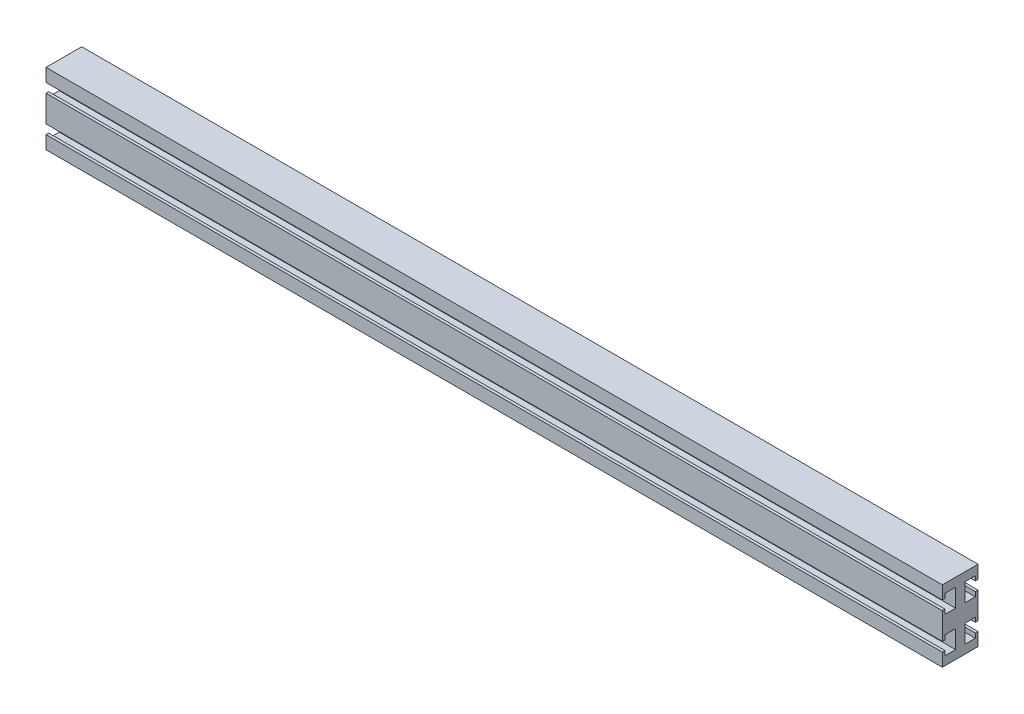
ISO-10303-21;
HEADER;
FILE_DESCRIPTION(('STEP AP214'),'2;1');
FILE_NAME('part.step','',(''),(''),'','','');
FILE_SCHEMA(('AUTOMOTIVE_DESIGN { 1 0 10303 214 1 1 1 1 }'));
ENDSEC;
DATA;
#1=APPLICATION_CONTEXT('core data for automotive mechanical design processes');
#2=APPLICATION_PROTOCOL_DEFINITION('international standard','automotive_design',2000,#1);
#3=PRODUCT_CONTEXT('',#1,'mechanical');
#4=PRODUCT('Part','Part','',(#3));
#5=PRODUCT_RELATED_PRODUCT_CATEGORY('part','',(#4));
#6=PRODUCT_DEFINITION_FORMATION('','',#4);
#7=PRODUCT_DEFINITION_CONTEXT('part definition',#1,'design');
#8=PRODUCT_DEFINITION('design','',#6,#7);
#9=PRODUCT_DEFINITION_SHAPE('','',#8);
#10=(LENGTH_UNIT() NAMED_UNIT(*) SI_UNIT(.MILLI.,.METRE.));
#11=(NAMED_UNIT(*) PLANE_ANGLE_UNIT() SI_UNIT($,.RADIAN.));
#12=(NAMED_UNIT(*) SI_UNIT($,.STERADIAN.) SOLID_ANGLE_UNIT());
#13=UNCERTAINTY_MEASURE_WITH_UNIT(LENGTH_MEASURE(1.E-05),#10,'distance_accuracy_value','');
#14=(GEOMETRIC_REPRESENTATION_CONTEXT(3) GLOBAL_UNCERTAINTY_ASSIGNED_CONTEXT((#13)) GLOBAL_UNIT_ASSIGNED_CONTEXT((#10,
#11,#12)) REPRESENTATION_CONTEXT('',''));
#15=CARTESIAN_POINT('',(0.,0.,0.));
#16=DIRECTION('',(0.,0.,1.));
#17=DIRECTION('',(1.,0.,0.));
#18=AXIS2_PLACEMENT_3D('',#15,#16,#17);
#19=CARTESIAN_POINT('',(250.,19.91,9.95));
#20=DIRECTION('',(-1.,0.,0.));
#21=DIRECTION('',(0.,0.,1.));
#22=AXIS2_PLACEMENT_3D('',#19,#20,#21);
#23=PLANE('',#22);
#24=DIRECTION('',(0.,0.,-1.));
#25=VECTOR('',#24,1.);
#26=CARTESIAN_POINT('',(250.,-7.42,9.95));
#27=LINE('',#26,#25);
#28=CARTESIAN_POINT('',(250.,-7.42,9.95));
#29=VERTEX_POINT('',#28);
#30=CARTESIAN_POINT('',(250.,-7.42,8.45));
#31=VERTEX_POINT('',#30);
#32=EDGE_CURVE('E289',#29,#31,#27,.T.);
#33=ORIENTED_EDGE('',*,*,#32,.T.);
#34=DIRECTION('',(0.,1.,0.));
#35=VECTOR('',#34,1.);
#36=CARTESIAN_POINT('',(250.,-7.42,8.45));
#37=LINE('',#36,#35);
#38=CARTESIAN_POINT('',(250.,-4.92,8.45));
#39=VERTEX_POINT('',#38);
#40=EDGE_CURVE('E292',#31,#39,#37,.T.);
#41=ORIENTED_EDGE('',*,*,#40,.T.);
#42=DIRECTION('',(0.,0.,-1.));
#43=VECTOR('',#42,1.);
#44=CARTESIAN_POINT('',(250.,-4.92,8.45));
#45=LINE('',#44,#43);
#46=CARTESIAN_POINT('',(250.,-4.92,2.56));
#47=VERTEX_POINT('',#46);
#48=EDGE_CURVE('E313',#39,#47,#45,.T.);
#49=ORIENTED_EDGE('',*,*,#48,.T.);
#50=DIRECTION('',(0.,-1.,0.));
#51=VECTOR('',#50,1.);
#52=CARTESIAN_POINT('',(250.,-4.92,2.56));
#53=LINE('',#52,#51);
#54=CARTESIAN_POINT('',(250.,-15.09,2.56));
#55=VERTEX_POINT('',#54);
#56=EDGE_CURVE('E310',#47,#55,#53,.T.);
#57=ORIENTED_EDGE('',*,*,#56,.T.);
#58=DIRECTION('',(0.,0.,1.));
#59=VECTOR('',#58,1.);
#60=CARTESIAN_POINT('',(250.,-15.09,2.56));
#61=LINE('',#60,#59);
#62=CARTESIAN_POINT('',(250.,-15.09,8.45));
#63=VERTEX_POINT('',#62);
#64=EDGE_CURVE('E307',#55,#63,#61,.T.);
#65=ORIENTED_EDGE('',*,*,#64,.T.);
#66=DIRECTION('',(0.,1.,0.));
#67=VECTOR('',#66,1.);
#68=CARTESIAN_POINT('',(250.,-15.09,8.45));
#69=LINE('',#68,#67);
#70=CARTESIAN_POINT('',(250.,-12.59,8.45));
#71=VERTEX_POINT('',#70);
#72=EDGE_CURVE('E305',#63,#71,#69,.T.);
#73=ORIENTED_EDGE('',*,*,#72,.T.);
#74=DIRECTION('',(0.,0.,1.));
#75=VECTOR('',#74,1.);
#76=CARTESIAN_POINT('',(250.,-12.59,8.45));
#77=LINE('',#76,#75);
#78=CARTESIAN_POINT('',(250.,-12.59,9.95));
#79=VERTEX_POINT('',#78);
#80=EDGE_CURVE('E280',#71,#79,#77,.T.);
#81=ORIENTED_EDGE('',*,*,#80,.T.);
#82=DIRECTION('',(0.,-1.,0.));
#83=VECTOR('',#82,1.);
#84=CARTESIAN_POINT('',(250.,19.91,9.95));
#85=LINE('',#84,#83);
#86=CARTESIAN_POINT('',(250.,-19.91,9.95));
#87=VERTEX_POINT('',#86);
#88=EDGE_CURVE('E509',#79,#87,#85,.T.);
#89=ORIENTED_EDGE('',*,*,#88,.T.);
#90=DIRECTION('',(0.,0.,-1.));
#91=VECTOR('',#90,1.);
#92=CARTESIAN_POINT('',(250.,-19.91,9.95));
#93=LINE('',#92,#91);
#94=CARTESIAN_POINT('',(250.,-19.91,-9.95));
#95=VERTEX_POINT('',#94);
#96=EDGE_CURVE('E485',#87,#95,#93,.T.);
#97=ORIENTED_EDGE('',*,*,#96,.T.);
#98=DIRECTION('',(0.,-1.,0.));
#99=VECTOR('',#98,1.);
#100=CARTESIAN_POINT('',(250.,19.91,-9.95));
#101=LINE('',#100,#99);
#102=CARTESIAN_POINT('',(250.,-12.59,-9.95));
#103=VERTEX_POINT('',#102);
#104=EDGE_CURVE('E42',#103,#95,#101,.T.);
#105=ORIENTED_EDGE('',*,*,#104,.F.);
#106=DIRECTION('',(0.,0.,-1.));
#107=VECTOR('',#106,1.);
#108=CARTESIAN_POINT('',(250.,-12.59,-8.45));
#109=LINE('',#108,#107);
#110=CARTESIAN_POINT('',(250.,-12.59,-8.45));
#111=VERTEX_POINT('',#110);
#112=EDGE_CURVE('E335',#111,#103,#109,.T.);
#113=ORIENTED_EDGE('',*,*,#112,.F.);
#114=DIRECTION('',(0.,1.,0.));
#115=VECTOR('',#114,1.);
#116=CARTESIAN_POINT('',(250.,-15.09,-8.45));
#117=LINE('',#116,#115);
#118=CARTESIAN_POINT('',(250.,-15.09,-8.45));
#119=VERTEX_POINT('',#118);
#120=EDGE_CURVE('E367',#119,#111,#117,.T.);
#121=ORIENTED_EDGE('',*,*,#120,.F.);
#122=DIRECTION('',(0.,0.,-1.));
#123=VECTOR('',#122,1.);
#124=CARTESIAN_POINT('',(250.,-15.09,-2.56));
#125=LINE('',#124,#123);
#126=CARTESIAN_POINT('',(250.,-15.09,-2.56));
#127=VERTEX_POINT('',#126);
#128=EDGE_CURVE('E364',#127,#119,#125,.T.);
#129=ORIENTED_EDGE('',*,*,#128,.F.);
#130=DIRECTION('',(0.,-1.,0.));
#131=VECTOR('',#130,1.);
#132=CARTESIAN_POINT('',(250.,-4.92,-2.56));
#133=LINE('',#132,#131);
#134=CARTESIAN_POINT('',(250.,-4.92,-2.56));
#135=VERTEX_POINT('',#134);
#136=EDGE_CURVE('E361',#135,#127,#133,.T.);
#137=ORIENTED_EDGE('',*,*,#136,.F.);
#138=DIRECTION('',(0.,0.,1.));
#139=VECTOR('',#138,1.);
#140=CARTESIAN_POINT('',(250.,-4.92,-8.45));
#141=LINE('',#140,#139);
#142=CARTESIAN_POINT('',(250.,-4.92,-8.45));
#143=VERTEX_POINT('',#142);
#144=EDGE_CURVE('E358',#143,#135,#141,.T.);
#145=ORIENTED_EDGE('',*,*,#144,.F.);
#146=DIRECTION('',(0.,1.,0.));
#147=VECTOR('',#146,1.);
#148=CARTESIAN_POINT('',(250.,-7.42,-8.45));
#149=LINE('',#148,#147);
#150=CARTESIAN_POINT('',(250.,-7.42,-8.45));
#151=VERTEX_POINT('',#150);
#152=EDGE_CURVE('E355',#151,#143,#149,.T.);
#153=ORIENTED_EDGE('',*,*,#152,.F.);
#154=DIRECTION('',(0.,0.,1.));
#155=VECTOR('',#154,1.);
#156=CARTESIAN_POINT('',(250.,-7.42,-9.95));
#157=LINE('',#156,#155);
#158=CARTESIAN_POINT('',(250.,-7.42,-9.95));
#159=VERTEX_POINT('',#158);
#160=EDGE_CURVE('E321',#159,#151,#157,.T.);
#161=ORIENTED_EDGE('',*,*,#160,.F.);
#162=CARTESIAN_POINT('',(250.,7.42,-9.95));
#163=VERTEX_POINT('',#162);
#164=EDGE_CURVE('E41',#163,#159,#101,.T.);
#165=ORIENTED_EDGE('',*,*,#164,.F.);
#166=DIRECTION('',(0.,0.,1.));
#167=VECTOR('',#166,1.);
#168=CARTESIAN_POINT('',(250.,7.42,-9.95));
#169=LINE('',#168,#167);
#170=CARTESIAN_POINT('',(250.,7.42,-8.45));
#171=VERTEX_POINT('',#170);
#172=EDGE_CURVE('E391',#163,#171,#169,.T.);
#173=ORIENTED_EDGE('',*,*,#172,.T.);
#174=DIRECTION('',(0.,-1.,0.));
#175=VECTOR('',#174,1.);
#176=CARTESIAN_POINT('',(250.,7.42,-8.45));
#177=LINE('',#176,#175);
#178=CARTESIAN_POINT('',(250.,4.92,-8.45));
#179=VERTEX_POINT('',#178);
#180=EDGE_CURVE('E419',#171,#179,#177,.T.);
#181=ORIENTED_EDGE('',*,*,#180,.T.);
#182=DIRECTION('',(0.,0.,1.));
#183=VECTOR('',#182,1.);
#184=CARTESIAN_POINT('',(250.,4.92,-8.45));
#185=LINE('',#184,#183);
#186=CARTESIAN_POINT('',(250.,4.92,-2.56));
#187=VERTEX_POINT('',#186);
#188=EDGE_CURVE('E416',#179,#187,#185,.T.);
#189=ORIENTED_EDGE('',*,*,#188,.T.);
#190=DIRECTION('',(0.,1.,0.));
#191=VECTOR('',#190,1.);
#192=CARTESIAN_POINT('',(250.,4.92,-2.56));
#193=LINE('',#192,#191);
#194=CARTESIAN_POINT('',(250.,15.09,-2.56));
#195=VERTEX_POINT('',#194);
#196=EDGE_CURVE('E413',#187,#195,#193,.T.);
#197=ORIENTED_EDGE('',*,*,#196,.T.);
#198=DIRECTION('',(0.,0.,-1.));
#199=VECTOR('',#198,1.);
#200=CARTESIAN_POINT('',(250.,15.09,-2.56));
#201=LINE('',#200,#199);
#202=CARTESIAN_POINT('',(250.,15.09,-8.45));
#203=VERTEX_POINT('',#202);
#204=EDGE_CURVE('E410',#195,#203,#201,.T.);
#205=ORIENTED_EDGE('',*,*,#204,.T.);
#206=DIRECTION('',(0.,-1.,0.));
#207=VECTOR('',#206,1.);
#208=CARTESIAN_POINT('',(250.,15.09,-8.45));
#209=LINE('',#208,#207);
#210=CARTESIAN_POINT('',(250.,12.59,-8.45));
#211=VERTEX_POINT('',#210);
#212=EDGE_CURVE('E407',#203,#211,#209,.T.);
#213=ORIENTED_EDGE('',*,*,#212,.T.);
#214=DIRECTION('',(0.,0.,-1.));
#215=VECTOR('',#214,1.);
#216=CARTESIAN_POINT('',(250.,12.59,-8.45));
#217=LINE('',#216,#215);
#218=CARTESIAN_POINT('',(250.,12.59,-9.95));
#219=VERTEX_POINT('',#218);
#220=EDGE_CURVE('E374',#211,#219,#217,.T.);
#221=ORIENTED_EDGE('',*,*,#220,.T.);
#222=CARTESIAN_POINT('',(250.,19.91,-9.95));
#223=VERTEX_POINT('',#222);
#224=EDGE_CURVE('E11',#223,#219,#101,.T.);
#225=ORIENTED_EDGE('',*,*,#224,.F.);
#226=DIRECTION('',(0.,0.,-1.));
#227=VECTOR('',#226,1.);
#228=CARTESIAN_POINT('',(250.,19.91,9.95));
#229=LINE('',#228,#227);
#230=CARTESIAN_POINT('',(250.,19.91,9.95));
#231=VERTEX_POINT('',#230);
#232=EDGE_CURVE('E499',#231,#223,#229,.T.);
#233=ORIENTED_EDGE('',*,*,#232,.F.);
#234=CARTESIAN_POINT('',(250.,12.59,9.95));
#235=VERTEX_POINT('',#234);
#236=EDGE_CURVE('E519',#231,#235,#85,.T.);
#237=ORIENTED_EDGE('',*,*,#236,.T.);
#238=DIRECTION('',(0.,0.,1.));
#239=VECTOR('',#238,1.);
#240=CARTESIAN_POINT('',(250.,12.59,8.45));
#241=LINE('',#240,#239);
#242=CARTESIAN_POINT('',(250.,12.59,8.45));
#243=VERTEX_POINT('',#242);
#244=EDGE_CURVE('E445',#243,#235,#241,.T.);
#245=ORIENTED_EDGE('',*,*,#244,.F.);
#246=DIRECTION('',(0.,-1.,0.));
#247=VECTOR('',#246,1.);
#248=CARTESIAN_POINT('',(250.,15.09,8.45));
#249=LINE('',#248,#247);
#250=CARTESIAN_POINT('',(250.,15.09,8.45));
#251=VERTEX_POINT('',#250);
#252=EDGE_CURVE('E478',#251,#243,#249,.T.);
#253=ORIENTED_EDGE('',*,*,#252,.F.);
#254=DIRECTION('',(0.,0.,1.));
#255=VECTOR('',#254,1.);
#256=CARTESIAN_POINT('',(250.,15.09,2.56));
#257=LINE('',#256,#255);
#258=CARTESIAN_POINT('',(250.,15.09,2.56));
#259=VERTEX_POINT('',#258);
#260=EDGE_CURVE('E475',#259,#251,#257,.T.);
#261=ORIENTED_EDGE('',*,*,#260,.F.);
#262=DIRECTION('',(0.,1.,0.));
#263=VECTOR('',#262,1.);
#264=CARTESIAN_POINT('',(250.,4.92,2.56));
#265=LINE('',#264,#263);
#266=CARTESIAN_POINT('',(250.,4.92,2.56));
#267=VERTEX_POINT('',#266);
#268=EDGE_CURVE('E472',#267,#259,#265,.T.);
#269=ORIENTED_EDGE('',*,*,#268,.F.);
#270=DIRECTION('',(0.,0.,-1.));
#271=VECTOR('',#270,1.);
#272=CARTESIAN_POINT('',(250.,4.92,8.45));
#273=LINE('',#272,#271);
#274=CARTESIAN_POINT('',(250.,4.92,8.45));
#275=VERTEX_POINT('',#274);
#276=EDGE_CURVE('E469',#275,#267,#273,.T.);
#277=ORIENTED_EDGE('',*,*,#276,.F.);
#278=DIRECTION('',(0.,-1.,0.));
#279=VECTOR('',#278,1.);
#280=CARTESIAN_POINT('',(250.,7.42,8.45));
#281=LINE('',#280,#279);
#282=CARTESIAN_POINT('',(250.,7.42,8.45));
#283=VERTEX_POINT('',#282);
#284=EDGE_CURVE('E466',#283,#275,#281,.T.);
#285=ORIENTED_EDGE('',*,*,#284,.F.);
#286=DIRECTION('',(0.,0.,-1.));
#287=VECTOR('',#286,1.);
#288=CARTESIAN_POINT('',(250.,7.42,9.95));
#289=LINE('',#288,#287);
#290=CARTESIAN_POINT('',(250.,7.42,9.95));
#291=VERTEX_POINT('',#290);
#292=EDGE_CURVE('E427',#291,#283,#289,.T.);
#293=ORIENTED_EDGE('',*,*,#292,.F.);
#294=EDGE_CURVE('E522',#291,#29,#85,.T.);
#295=ORIENTED_EDGE('',*,*,#294,.T.);
#296=EDGE_LOOP('',(#33,#41,#49,#57,#65,#73,#81,#89,#97,#105,#113,#121,#129,#137,#145,#153,#161,
#165,#173,#181,#189,#197,#205,#213,#221,#225,#233,#237,#245,#253,#261,#269,#277,#285,#293,#295));
#297=FACE_BOUND('',#296,.T.);
#298=ADVANCED_FACE('F34',(#297),#23,.F.);
#299=CARTESIAN_POINT('',(-250.,19.91,9.95));
#300=DIRECTION('',(1.,0.,0.));
#301=DIRECTION('',(0.,0.,-1.));
#302=AXIS2_PLACEMENT_3D('',#299,#300,#301);
#303=PLANE('',#302);
#304=DIRECTION('',(0.,0.,-1.));
#305=VECTOR('',#304,1.);
#306=CARTESIAN_POINT('',(-250.,-7.42,9.95));
#307=LINE('',#306,#305);
#308=CARTESIAN_POINT('',(-250.,-7.42,9.95));
#309=VERTEX_POINT('',#308);
#310=CARTESIAN_POINT('',(-250.,-7.42,8.45));
#311=VERTEX_POINT('',#310);
#312=EDGE_CURVE('E302',#309,#311,#307,.T.);
#313=ORIENTED_EDGE('',*,*,#312,.F.);
#314=DIRECTION('',(0.,-1.,0.));
#315=VECTOR('',#314,1.);
#316=CARTESIAN_POINT('',(-250.,19.91,9.95));
#317=LINE('',#316,#315);
#318=CARTESIAN_POINT('',(-250.,7.42,9.95));
#319=VERTEX_POINT('',#318);
#320=EDGE_CURVE('E526',#319,#309,#317,.T.);
#321=ORIENTED_EDGE('',*,*,#320,.F.);
#322=DIRECTION('',(0.,0.,-1.));
#323=VECTOR('',#322,1.);
#324=CARTESIAN_POINT('',(-250.,7.42,9.95));
#325=LINE('',#324,#323);
#326=CARTESIAN_POINT('',(-250.,7.42,8.45));
#327=VERTEX_POINT('',#326);
#328=EDGE_CURVE('E441',#319,#327,#325,.T.);
#329=ORIENTED_EDGE('',*,*,#328,.T.);
#330=DIRECTION('',(0.,-1.,0.));
#331=VECTOR('',#330,1.);
#332=CARTESIAN_POINT('',(-250.,7.42,8.45));
#333=LINE('',#332,#331);
#334=CARTESIAN_POINT('',(-250.,4.92,8.45));
#335=VERTEX_POINT('',#334);
#336=EDGE_CURVE('E444',#327,#335,#333,.T.);
#337=ORIENTED_EDGE('',*,*,#336,.T.);
#338=DIRECTION('',(0.,0.,-1.));
#339=VECTOR('',#338,1.);
#340=CARTESIAN_POINT('',(-250.,4.92,8.45));
#341=LINE('',#340,#339);
#342=CARTESIAN_POINT('',(-250.,4.92,2.56));
#343=VERTEX_POINT('',#342);
#344=EDGE_CURVE('E448',#335,#343,#341,.T.);
#345=ORIENTED_EDGE('',*,*,#344,.T.);
#346=DIRECTION('',(0.,1.,0.));
#347=VECTOR('',#346,1.);
#348=CARTESIAN_POINT('',(-250.,4.92,2.56));
#349=LINE('',#348,#347);
#350=CARTESIAN_POINT('',(-250.,15.09,2.56));
#351=VERTEX_POINT('',#350);
#352=EDGE_CURVE('E451',#343,#351,#349,.T.);
#353=ORIENTED_EDGE('',*,*,#352,.T.);
#354=DIRECTION('',(0.,0.,1.));
#355=VECTOR('',#354,1.);
#356=CARTESIAN_POINT('',(-250.,15.09,2.56));
#357=LINE('',#356,#355);
#358=CARTESIAN_POINT('',(-250.,15.09,8.45));
#359=VERTEX_POINT('',#358);
#360=EDGE_CURVE('E454',#351,#359,#357,.T.);
#361=ORIENTED_EDGE('',*,*,#360,.T.);
#362=DIRECTION('',(0.,-1.,0.));
#363=VECTOR('',#362,1.);
#364=CARTESIAN_POINT('',(-250.,15.09,8.45));
#365=LINE('',#364,#363);
#366=CARTESIAN_POINT('',(-250.,12.59,8.45));
#367=VERTEX_POINT('',#366);
#368=EDGE_CURVE('E457',#359,#367,#365,.T.);
#369=ORIENTED_EDGE('',*,*,#368,.T.);
#370=DIRECTION('',(0.,0.,1.));
#371=VECTOR('',#370,1.);
#372=CARTESIAN_POINT('',(-250.,12.59,8.45));
#373=LINE('',#372,#371);
#374=CARTESIAN_POINT('',(-250.,12.59,9.95));
#375=VERTEX_POINT('',#374);
#376=EDGE_CURVE('E460',#367,#375,#373,.T.);
#377=ORIENTED_EDGE('',*,*,#376,.T.);
#378=CARTESIAN_POINT('',(-250.,19.91,9.95));
#379=VERTEX_POINT('',#378);
#380=EDGE_CURVE('E523',#379,#375,#317,.T.);
#381=ORIENTED_EDGE('',*,*,#380,.F.);
#382=DIRECTION('',(0.,0.,1.));
#383=VECTOR('',#382,1.);
#384=CARTESIAN_POINT('',(-250.,19.91,9.95));
#385=LINE('',#384,#383);
#386=CARTESIAN_POINT('',(-250.,19.91,-9.95));
#387=VERTEX_POINT('',#386);
#388=EDGE_CURVE('E505',#387,#379,#385,.T.);
#389=ORIENTED_EDGE('',*,*,#388,.F.);
#390=DIRECTION('',(0.,-1.,0.));
#391=VECTOR('',#390,1.);
#392=CARTESIAN_POINT('',(-250.,19.91,-9.95));
#393=LINE('',#392,#391);
#394=CARTESIAN_POINT('',(-250.,12.59,-9.95));
#395=VERTEX_POINT('',#394);
#396=EDGE_CURVE('E527',#387,#395,#393,.T.);
#397=ORIENTED_EDGE('',*,*,#396,.T.);
#398=DIRECTION('',(0.,0.,-1.));
#399=VECTOR('',#398,1.);
#400=CARTESIAN_POINT('',(-250.,12.59,-8.45));
#401=LINE('',#400,#399);
#402=CARTESIAN_POINT('',(-250.,12.59,-8.45));
#403=VERTEX_POINT('',#402);
#404=EDGE_CURVE('E388',#403,#395,#401,.T.);
#405=ORIENTED_EDGE('',*,*,#404,.F.);
#406=DIRECTION('',(0.,-1.,0.));
#407=VECTOR('',#406,1.);
#408=CARTESIAN_POINT('',(-250.,15.09,-8.45));
#409=LINE('',#408,#407);
#410=CARTESIAN_POINT('',(-250.,15.09,-8.45));
#411=VERTEX_POINT('',#410);
#412=EDGE_CURVE('E390',#411,#403,#409,.T.);
#413=ORIENTED_EDGE('',*,*,#412,.F.);
#414=DIRECTION('',(0.,0.,-1.));
#415=VECTOR('',#414,1.);
#416=CARTESIAN_POINT('',(-250.,15.09,-2.56));
#417=LINE('',#416,#415);
#418=CARTESIAN_POINT('',(-250.,15.09,-2.56));
#419=VERTEX_POINT('',#418);
#420=EDGE_CURVE('E394',#419,#411,#417,.T.);
#421=ORIENTED_EDGE('',*,*,#420,.F.);
#422=DIRECTION('',(0.,1.,0.));
#423=VECTOR('',#422,1.);
#424=CARTESIAN_POINT('',(-250.,4.92,-2.56));
#425=LINE('',#424,#423);
#426=CARTESIAN_POINT('',(-250.,4.92,-2.56));
#427=VERTEX_POINT('',#426);
#428=EDGE_CURVE('E396',#427,#419,#425,.T.);
#429=ORIENTED_EDGE('',*,*,#428,.F.);
#430=DIRECTION('',(0.,0.,1.));
#431=VECTOR('',#430,1.);
#432=CARTESIAN_POINT('',(-250.,4.92,-8.45));
#433=LINE('',#432,#431);
#434=CARTESIAN_POINT('',(-250.,4.92,-8.45));
#435=VERTEX_POINT('',#434);
#436=EDGE_CURVE('E398',#435,#427,#433,.T.);
#437=ORIENTED_EDGE('',*,*,#436,.F.);
#438=DIRECTION('',(0.,-1.,0.));
#439=VECTOR('',#438,1.);
#440=CARTESIAN_POINT('',(-250.,7.42,-8.45));
#441=LINE('',#440,#439);
#442=CARTESIAN_POINT('',(-250.,7.42,-8.45));
#443=VERTEX_POINT('',#442);
#444=EDGE_CURVE('E400',#443,#435,#441,.T.);
#445=ORIENTED_EDGE('',*,*,#444,.F.);
#446=DIRECTION('',(0.,0.,1.));
#447=VECTOR('',#446,1.);
#448=CARTESIAN_POINT('',(-250.,7.42,-9.95));
#449=LINE('',#448,#447);
#450=CARTESIAN_POINT('',(-250.,7.42,-9.95));
#451=VERTEX_POINT('',#450);
#452=EDGE_CURVE('E402',#451,#443,#449,.T.);
#453=ORIENTED_EDGE('',*,*,#452,.F.);
#454=CARTESIAN_POINT('',(-250.,-7.42,-9.95));
#455=VERTEX_POINT('',#454);
#456=EDGE_CURVE('E529',#451,#455,#393,.T.);
#457=ORIENTED_EDGE('',*,*,#456,.T.);
#458=DIRECTION('',(0.,0.,1.));
#459=VECTOR('',#458,1.);
#460=CARTESIAN_POINT('',(-250.,-7.42,-9.95));
#461=LINE('',#460,#459);
#462=CARTESIAN_POINT('',(-250.,-7.42,-8.45));
#463=VERTEX_POINT('',#462);
#464=EDGE_CURVE('E332',#455,#463,#461,.T.);
#465=ORIENTED_EDGE('',*,*,#464,.T.);
#466=DIRECTION('',(0.,1.,0.));
#467=VECTOR('',#466,1.);
#468=CARTESIAN_POINT('',(-250.,-7.42,-8.45));
#469=LINE('',#468,#467);
#470=CARTESIAN_POINT('',(-250.,-4.92,-8.45));
#471=VERTEX_POINT('',#470);
#472=EDGE_CURVE('E57',#463,#471,#469,.T.);
#473=ORIENTED_EDGE('',*,*,#472,.T.);
#474=DIRECTION('',(0.,0.,1.));
#475=VECTOR('',#474,1.);
#476=CARTESIAN_POINT('',(-250.,-4.92,-8.45));
#477=LINE('',#476,#475);
#478=CARTESIAN_POINT('',(-250.,-4.92,-2.56));
#479=VERTEX_POINT('',#478);
#480=EDGE_CURVE('E337',#471,#479,#477,.T.);
#481=ORIENTED_EDGE('',*,*,#480,.T.);
#482=DIRECTION('',(0.,-1.,0.));
#483=VECTOR('',#482,1.);
#484=CARTESIAN_POINT('',(-250.,-4.92,-2.56));
#485=LINE('',#484,#483);
#486=CARTESIAN_POINT('',(-250.,-15.09,-2.56));
#487=VERTEX_POINT('',#486);
#488=EDGE_CURVE('E340',#479,#487,#485,.T.);
#489=ORIENTED_EDGE('',*,*,#488,.T.);
#490=DIRECTION('',(0.,0.,-1.));
#491=VECTOR('',#490,1.);
#492=CARTESIAN_POINT('',(-250.,-15.09,-2.56));
#493=LINE('',#492,#491);
#494=CARTESIAN_POINT('',(-250.,-15.09,-8.45));
#495=VERTEX_POINT('',#494);
#496=EDGE_CURVE('E343',#487,#495,#493,.T.);
#497=ORIENTED_EDGE('',*,*,#496,.T.);
#498=DIRECTION('',(0.,1.,0.));
#499=VECTOR('',#498,1.);
#500=CARTESIAN_POINT('',(-250.,-15.09,-8.45));
#501=LINE('',#500,#499);
#502=CARTESIAN_POINT('',(-250.,-12.59,-8.45));
#503=VERTEX_POINT('',#502);
#504=EDGE_CURVE('E346',#495,#503,#501,.T.);
#505=ORIENTED_EDGE('',*,*,#504,.T.);
#506=DIRECTION('',(0.,0.,-1.));
#507=VECTOR('',#506,1.);
#508=CARTESIAN_POINT('',(-250.,-12.59,-8.45));
#509=LINE('',#508,#507);
#510=CARTESIAN_POINT('',(-250.,-12.59,-9.95));
#511=VERTEX_POINT('',#510);
#512=EDGE_CURVE('E349',#503,#511,#509,.T.);
#513=ORIENTED_EDGE('',*,*,#512,.T.);
#514=CARTESIAN_POINT('',(-250.,-19.91,-9.95));
#515=VERTEX_POINT('',#514);
#516=EDGE_CURVE('E525',#511,#515,#393,.T.);
#517=ORIENTED_EDGE('',*,*,#516,.T.);
#518=DIRECTION('',(0.,0.,1.));
#519=VECTOR('',#518,1.);
#520=CARTESIAN_POINT('',(-250.,-19.91,9.95));
#521=LINE('',#520,#519);
#522=CARTESIAN_POINT('',(-250.,-19.91,9.95));
#523=VERTEX_POINT('',#522);
#524=EDGE_CURVE('E515',#515,#523,#521,.T.);
#525=ORIENTED_EDGE('',*,*,#524,.T.);
#526=CARTESIAN_POINT('',(-250.,-12.59,9.95));
#527=VERTEX_POINT('',#526);
#528=EDGE_CURVE('E288',#527,#523,#317,.T.);
#529=ORIENTED_EDGE('',*,*,#528,.F.);
#530=DIRECTION('',(0.,0.,1.));
#531=VECTOR('',#530,1.);
#532=CARTESIAN_POINT('',(-250.,-12.59,8.45));
#533=LINE('',#532,#531);
#534=CARTESIAN_POINT('',(-250.,-12.59,8.45));
#535=VERTEX_POINT('',#534);
#536=EDGE_CURVE('E49',#535,#527,#533,.T.);
#537=ORIENTED_EDGE('',*,*,#536,.F.);
#538=DIRECTION('',(0.,1.,0.));
#539=VECTOR('',#538,1.);
#540=CARTESIAN_POINT('',(-250.,-15.09,8.45));
#541=LINE('',#540,#539);
#542=CARTESIAN_POINT('',(-250.,-15.09,8.45));
#543=VERTEX_POINT('',#542);
#544=EDGE_CURVE('E268',#543,#535,#541,.T.);
#545=ORIENTED_EDGE('',*,*,#544,.F.);
#546=DIRECTION('',(0.,0.,1.));
#547=VECTOR('',#546,1.);
#548=CARTESIAN_POINT('',(-250.,-15.09,2.56));
#549=LINE('',#548,#547);
#550=CARTESIAN_POINT('',(-250.,-15.09,2.56));
#551=VERTEX_POINT('',#550);
#552=EDGE_CURVE('E276',#551,#543,#549,.T.);
#553=ORIENTED_EDGE('',*,*,#552,.F.);
#554=DIRECTION('',(0.,-1.,0.));
#555=VECTOR('',#554,1.);
#556=CARTESIAN_POINT('',(-250.,-4.92,2.56));
#557=LINE('',#556,#555);
#558=CARTESIAN_POINT('',(-250.,-4.92,2.56));
#559=VERTEX_POINT('',#558);
#560=EDGE_CURVE('E296',#559,#551,#557,.T.);
#561=ORIENTED_EDGE('',*,*,#560,.F.);
#562=DIRECTION('',(0.,0.,-1.));
#563=VECTOR('',#562,1.);
#564=CARTESIAN_POINT('',(-250.,-4.92,8.45));
#565=LINE('',#564,#563);
#566=CARTESIAN_POINT('',(-250.,-4.92,8.45));
#567=VERTEX_POINT('',#566);
#568=EDGE_CURVE('E298',#567,#559,#565,.T.);
#569=ORIENTED_EDGE('',*,*,#568,.F.);
#570=DIRECTION('',(0.,1.,0.));
#571=VECTOR('',#570,1.);
#572=CARTESIAN_POINT('',(-250.,-7.42,8.45));
#573=LINE('',#572,#571);
#574=EDGE_CURVE('E300',#311,#567,#573,.T.);
#575=ORIENTED_EDGE('',*,*,#574,.F.);
#576=EDGE_LOOP('',(#313,#321,#329,#337,#345,#353,#361,#369,#377,#381,#389,#397,#405,#413,#421,
#429,#437,#445,#453,#457,#465,#473,#481,#489,#497,#505,#513,#517,#525,#529,#537,#545,#553,#561,
#569,#575));
#577=FACE_BOUND('',#576,.T.);
#578=ADVANCED_FACE('F286',(#577),#303,.F.);
#579=CARTESIAN_POINT('',(-250.,19.91,9.95));
#580=DIRECTION('',(0.,0.,-1.));
#581=DIRECTION('',(-1.,0.,0.));
#582=AXIS2_PLACEMENT_3D('',#579,#580,#581);
#583=PLANE('',#582);
#584=DIRECTION('',(1.,0.,0.));
#585=VECTOR('',#584,1.);
#586=CARTESIAN_POINT('',(-250.,-7.42,9.95));
#587=LINE('',#586,#585);
#588=EDGE_CURVE('E318',#309,#29,#587,.T.);
#589=ORIENTED_EDGE('',*,*,#588,.T.);
#590=ORIENTED_EDGE('',*,*,#294,.F.);
#591=DIRECTION('',(1.,0.,0.));
#592=VECTOR('',#591,1.);
#593=CARTESIAN_POINT('',(-250.,7.42,9.95));
#594=LINE('',#593,#592);
#595=EDGE_CURVE('E463',#319,#291,#594,.T.);
#596=ORIENTED_EDGE('',*,*,#595,.F.);
#597=ORIENTED_EDGE('',*,*,#320,.T.);
#598=EDGE_LOOP('',(#589,#590,#596,#597));
#599=FACE_BOUND('',#598,.T.);
#600=ADVANCED_FACE('F552',(#599),#583,.F.);
#601=DIRECTION('',(1.,0.,0.));
#602=VECTOR('',#601,1.);
#603=CARTESIAN_POINT('',(-250.,-12.59,9.95));
#604=LINE('',#603,#602);
#605=EDGE_CURVE('E282',#527,#79,#604,.T.);
#606=ORIENTED_EDGE('',*,*,#605,.F.);
#607=ORIENTED_EDGE('',*,*,#528,.T.);
#608=DIRECTION('',(1.,0.,0.));
#609=VECTOR('',#608,1.);
#610=CARTESIAN_POINT('',(-250.,-19.91,9.95));
#611=LINE('',#610,#609);
#612=EDGE_CURVE('E503',#523,#87,#611,.T.);
#613=ORIENTED_EDGE('',*,*,#612,.T.);
#614=ORIENTED_EDGE('',*,*,#88,.F.);
#615=EDGE_LOOP('',(#606,#607,#613,#614));
#616=FACE_BOUND('',#615,.T.);
#617=ADVANCED_FACE('F547',(#616),#583,.F.);
#618=CARTESIAN_POINT('',(-250.,19.91,-9.95));
#619=DIRECTION('',(0.,0.,1.));
#620=DIRECTION('',(1.,0.,0.));
#621=AXIS2_PLACEMENT_3D('',#618,#619,#620);
#622=PLANE('',#621);
#623=ORIENTED_EDGE('',*,*,#516,.F.);
#624=DIRECTION('',(1.,0.,0.));
#625=VECTOR('',#624,1.);
#626=CARTESIAN_POINT('',(-250.,-12.59,-9.95));
#627=LINE('',#626,#625);
#628=EDGE_CURVE('E371',#511,#103,#627,.T.);
#629=ORIENTED_EDGE('',*,*,#628,.T.);
#630=ORIENTED_EDGE('',*,*,#104,.T.);
#631=DIRECTION('',(-1.,0.,0.));
#632=VECTOR('',#631,1.);
#633=CARTESIAN_POINT('',(-250.,-19.91,-9.95));
#634=LINE('',#633,#632);
#635=EDGE_CURVE('E512',#95,#515,#634,.T.);
#636=ORIENTED_EDGE('',*,*,#635,.T.);
#637=EDGE_LOOP('',(#623,#629,#630,#636));
#638=FACE_BOUND('',#637,.T.);
#639=ADVANCED_FACE('F540',(#638),#622,.F.);
#640=ORIENTED_EDGE('',*,*,#164,.T.);
#641=DIRECTION('',(1.,0.,0.));
#642=VECTOR('',#641,1.);
#643=CARTESIAN_POINT('',(-250.,-7.42,-9.95));
#644=LINE('',#643,#642);
#645=EDGE_CURVE('E352',#455,#159,#644,.T.);
#646=ORIENTED_EDGE('',*,*,#645,.F.);
#647=ORIENTED_EDGE('',*,*,#456,.F.);
#648=DIRECTION('',(1.,0.,0.));
#649=VECTOR('',#648,1.);
#650=CARTESIAN_POINT('',(-250.,7.42,-9.95));
#651=LINE('',#650,#649);
#652=EDGE_CURVE('E424',#451,#163,#651,.T.);
#653=ORIENTED_EDGE('',*,*,#652,.T.);
#654=EDGE_LOOP('',(#640,#646,#647,#653));
#655=FACE_BOUND('',#654,.T.);
#656=ADVANCED_FACE('F598',(#655),#622,.F.);
#657=DIRECTION('',(1.,0.,0.));
#658=VECTOR('',#657,1.);
#659=CARTESIAN_POINT('',(-250.,12.59,-9.95));
#660=LINE('',#659,#658);
#661=EDGE_CURVE('E404',#395,#219,#660,.T.);
#662=ORIENTED_EDGE('',*,*,#661,.F.);
#663=ORIENTED_EDGE('',*,*,#396,.F.);
#664=DIRECTION('',(-1.,0.,0.));
#665=VECTOR('',#664,1.);
#666=CARTESIAN_POINT('',(-250.,19.91,-9.95));
#667=LINE('',#666,#665);
#668=EDGE_CURVE('E502',#223,#387,#667,.T.);
#669=ORIENTED_EDGE('',*,*,#668,.F.);
#670=ORIENTED_EDGE('',*,*,#224,.T.);
#671=EDGE_LOOP('',(#662,#663,#669,#670));
#672=FACE_BOUND('',#671,.T.);
#673=ADVANCED_FACE('F600',(#672),#622,.F.);
#674=ORIENTED_EDGE('',*,*,#380,.T.);
#675=DIRECTION('',(1.,0.,0.));
#676=VECTOR('',#675,1.);
#677=CARTESIAN_POINT('',(-250.,12.59,9.95));
#678=LINE('',#677,#676);
#679=EDGE_CURVE('E482',#375,#235,#678,.T.);
#680=ORIENTED_EDGE('',*,*,#679,.T.);
#681=ORIENTED_EDGE('',*,*,#236,.F.);
#682=DIRECTION('',(1.,0.,0.));
#683=VECTOR('',#682,1.);
#684=CARTESIAN_POINT('',(-250.,19.91,9.95));
#685=LINE('',#684,#683);
#686=EDGE_CURVE('E507',#379,#231,#685,.T.);
#687=ORIENTED_EDGE('',*,*,#686,.F.);
#688=EDGE_LOOP('',(#674,#680,#681,#687));
#689=FACE_BOUND('',#688,.T.);
#690=ADVANCED_FACE('F596',(#689),#583,.F.);
#691=CARTESIAN_POINT('',(0.,19.91,0.));
#692=DIRECTION('',(0.,-1.,0.));
#693=DIRECTION('',(0.,0.,-1.));
#694=AXIS2_PLACEMENT_3D('',#691,#692,#693);
#695=PLANE('',#694);
#696=ORIENTED_EDGE('',*,*,#232,.T.);
#697=ORIENTED_EDGE('',*,*,#668,.T.);
#698=ORIENTED_EDGE('',*,*,#388,.T.);
#699=ORIENTED_EDGE('',*,*,#686,.T.);
#700=EDGE_LOOP('',(#696,#697,#698,#699));
#701=FACE_BOUND('',#700,.T.);
#702=ADVANCED_FACE('F653',(#701),#695,.F.);
#703=CARTESIAN_POINT('',(0.,-19.91,0.));
#704=DIRECTION('',(0.,-1.,0.));
#705=DIRECTION('',(0.,0.,-1.));
#706=AXIS2_PLACEMENT_3D('',#703,#704,#705);
#707=PLANE('',#706);
#708=ORIENTED_EDGE('',*,*,#96,.F.);
#709=ORIENTED_EDGE('',*,*,#612,.F.);
#710=ORIENTED_EDGE('',*,*,#524,.F.);
#711=ORIENTED_EDGE('',*,*,#635,.F.);
#712=EDGE_LOOP('',(#708,#709,#710,#711));
#713=FACE_BOUND('',#712,.T.);
#714=ADVANCED_FACE('F544',(#713),#707,.T.);
#715=CARTESIAN_POINT('',(-250.,12.59,8.45));
#716=DIRECTION('',(0.,1.,0.));
#717=DIRECTION('',(0.,0.,1.));
#718=AXIS2_PLACEMENT_3D('',#715,#716,#717);
#719=PLANE('',#718);
#720=ORIENTED_EDGE('',*,*,#244,.T.);
#721=ORIENTED_EDGE('',*,*,#679,.F.);
#722=ORIENTED_EDGE('',*,*,#376,.F.);
#723=DIRECTION('',(1.,0.,0.));
#724=VECTOR('',#723,1.);
#725=CARTESIAN_POINT('',(-250.,12.59,8.45));
#726=LINE('',#725,#724);
#727=EDGE_CURVE('E486',#367,#243,#726,.T.);
#728=ORIENTED_EDGE('',*,*,#727,.T.);
#729=EDGE_LOOP('',(#720,#721,#722,#728));
#730=FACE_BOUND('',#729,.T.);
#731=ADVANCED_FACE('F659',(#730),#719,.F.);
#732=CARTESIAN_POINT('',(-250.,15.09,8.45));
#733=DIRECTION('',(0.,0.,1.));
#734=DIRECTION('',(1.,0.,0.));
#735=AXIS2_PLACEMENT_3D('',#732,#733,#734);
#736=PLANE('',#735);
#737=ORIENTED_EDGE('',*,*,#252,.T.);
#738=ORIENTED_EDGE('',*,*,#727,.F.);
#739=ORIENTED_EDGE('',*,*,#368,.F.);
#740=DIRECTION('',(1.,0.,0.));
#741=VECTOR('',#740,1.);
#742=CARTESIAN_POINT('',(-250.,15.09,8.45));
#743=LINE('',#742,#741);
#744=EDGE_CURVE('E488',#359,#251,#743,.T.);
#745=ORIENTED_EDGE('',*,*,#744,.T.);
#746=EDGE_LOOP('',(#737,#738,#739,#745));
#747=FACE_BOUND('',#746,.T.);
#748=ADVANCED_FACE('F663',(#747),#736,.F.);
#749=CARTESIAN_POINT('',(-250.,15.09,2.56));
#750=DIRECTION('',(0.,1.,0.));
#751=DIRECTION('',(0.,0.,1.));
#752=AXIS2_PLACEMENT_3D('',#749,#750,#751);
#753=PLANE('',#752);
#754=ORIENTED_EDGE('',*,*,#260,.T.);
#755=ORIENTED_EDGE('',*,*,#744,.F.);
#756=ORIENTED_EDGE('',*,*,#360,.F.);
#757=DIRECTION('',(1.,0.,0.));
#758=VECTOR('',#757,1.);
#759=CARTESIAN_POINT('',(-250.,15.09,2.56));
#760=LINE('',#759,#758);
#761=EDGE_CURVE('E490',#351,#259,#760,.T.);
#762=ORIENTED_EDGE('',*,*,#761,.T.);
#763=EDGE_LOOP('',(#754,#755,#756,#762));
#764=FACE_BOUND('',#763,.T.);
#765=ADVANCED_FACE('F669',(#764),#753,.F.);
#766=CARTESIAN_POINT('',(-250.,4.92,2.56));
#767=DIRECTION('',(0.,0.,-1.));
#768=DIRECTION('',(0.,1.,0.));
#769=AXIS2_PLACEMENT_3D('',#766,#767,#768);
#770=PLANE('',#769);
#771=ORIENTED_EDGE('',*,*,#268,.T.);
#772=ORIENTED_EDGE('',*,*,#761,.F.);
#773=ORIENTED_EDGE('',*,*,#352,.F.);
#774=DIRECTION('',(1.,0.,0.));
#775=VECTOR('',#774,1.);
#776=CARTESIAN_POINT('',(-250.,4.92,2.56));
#777=LINE('',#776,#775);
#778=EDGE_CURVE('E492',#343,#267,#777,.T.);
#779=ORIENTED_EDGE('',*,*,#778,.T.);
#780=EDGE_LOOP('',(#771,#772,#773,#779));
#781=FACE_BOUND('',#780,.T.);
#782=ADVANCED_FACE('F672',(#781),#770,.F.);
#783=CARTESIAN_POINT('',(-250.,4.92,8.45));
#784=DIRECTION('',(0.,-1.,0.));
#785=DIRECTION('',(0.,0.,-1.));
#786=AXIS2_PLACEMENT_3D('',#783,#784,#785);
#787=PLANE('',#786);
#788=ORIENTED_EDGE('',*,*,#276,.T.);
#789=ORIENTED_EDGE('',*,*,#778,.F.);
#790=ORIENTED_EDGE('',*,*,#344,.F.);
#791=DIRECTION('',(1.,0.,0.));
#792=VECTOR('',#791,1.);
#793=CARTESIAN_POINT('',(-250.,4.92,8.45));
#794=LINE('',#793,#792);
#795=EDGE_CURVE('E494',#335,#275,#794,.T.);
#796=ORIENTED_EDGE('',*,*,#795,.T.);
#797=EDGE_LOOP('',(#788,#789,#790,#796));
#798=FACE_BOUND('',#797,.T.);
#799=ADVANCED_FACE('F675',(#798),#787,.F.);
#800=CARTESIAN_POINT('',(-250.,7.42,8.45));
#801=DIRECTION('',(0.,0.,1.));
#802=DIRECTION('',(1.,0.,0.));
#803=AXIS2_PLACEMENT_3D('',#800,#801,#802);
#804=PLANE('',#803);
#805=ORIENTED_EDGE('',*,*,#284,.T.);
#806=ORIENTED_EDGE('',*,*,#795,.F.);
#807=ORIENTED_EDGE('',*,*,#336,.F.);
#808=DIRECTION('',(1.,0.,0.));
#809=VECTOR('',#808,1.);
#810=CARTESIAN_POINT('',(-250.,7.42,8.45));
#811=LINE('',#810,#809);
#812=EDGE_CURVE('E496',#327,#283,#811,.T.);
#813=ORIENTED_EDGE('',*,*,#812,.T.);
#814=EDGE_LOOP('',(#805,#806,#807,#813));
#815=FACE_BOUND('',#814,.T.);
#816=ADVANCED_FACE('F677',(#815),#804,.F.);
#817=CARTESIAN_POINT('',(-250.,7.42,9.95));
#818=DIRECTION('',(0.,-1.,0.));
#819=DIRECTION('',(0.,0.,-1.));
#820=AXIS2_PLACEMENT_3D('',#817,#818,#819);
#821=PLANE('',#820);
#822=ORIENTED_EDGE('',*,*,#292,.T.);
#823=ORIENTED_EDGE('',*,*,#812,.F.);
#824=ORIENTED_EDGE('',*,*,#328,.F.);
#825=ORIENTED_EDGE('',*,*,#595,.T.);
#826=EDGE_LOOP('',(#822,#823,#824,#825));
#827=FACE_BOUND('',#826,.T.);
#828=ADVANCED_FACE('F680',(#827),#821,.F.);
#829=CARTESIAN_POINT('',(-250.,7.42,-9.95));
#830=DIRECTION('',(0.,1.,0.));
#831=DIRECTION('',(0.,0.,1.));
#832=AXIS2_PLACEMENT_3D('',#829,#830,#831);
#833=PLANE('',#832);
#834=ORIENTED_EDGE('',*,*,#172,.F.);
#835=ORIENTED_EDGE('',*,*,#652,.F.);
#836=ORIENTED_EDGE('',*,*,#452,.T.);
#837=DIRECTION('',(1.,0.,0.));
#838=VECTOR('',#837,1.);
#839=CARTESIAN_POINT('',(-250.,7.42,-8.45));
#840=LINE('',#839,#838);
#841=EDGE_CURVE('E428',#443,#171,#840,.T.);
#842=ORIENTED_EDGE('',*,*,#841,.T.);
#843=EDGE_LOOP('',(#834,#835,#836,#842));
#844=FACE_BOUND('',#843,.T.);
#845=ADVANCED_FACE('F621',(#844),#833,.T.);
#846=CARTESIAN_POINT('',(-250.,7.42,-8.45));
#847=DIRECTION('',(0.,0.,1.));
#848=DIRECTION('',(1.,0.,0.));
#849=AXIS2_PLACEMENT_3D('',#846,#847,#848);
#850=PLANE('',#849);
#851=ORIENTED_EDGE('',*,*,#180,.F.);
#852=ORIENTED_EDGE('',*,*,#841,.F.);
#853=ORIENTED_EDGE('',*,*,#444,.T.);
#854=DIRECTION('',(1.,0.,0.));
#855=VECTOR('',#854,1.);
#856=CARTESIAN_POINT('',(-250.,4.92,-8.45));
#857=LINE('',#856,#855);
#858=EDGE_CURVE('E430',#435,#179,#857,.T.);
#859=ORIENTED_EDGE('',*,*,#858,.T.);
#860=EDGE_LOOP('',(#851,#852,#853,#859));
#861=FACE_BOUND('',#860,.T.);
#862=ADVANCED_FACE('F624',(#861),#850,.T.);
#863=CARTESIAN_POINT('',(-250.,4.92,-8.45));
#864=DIRECTION('',(0.,1.,0.));
#865=DIRECTION('',(0.,0.,1.));
#866=AXIS2_PLACEMENT_3D('',#863,#864,#865);
#867=PLANE('',#866);
#868=ORIENTED_EDGE('',*,*,#188,.F.);
#869=ORIENTED_EDGE('',*,*,#858,.F.);
#870=ORIENTED_EDGE('',*,*,#436,.T.);
#871=DIRECTION('',(1.,0.,0.));
#872=VECTOR('',#871,1.);
#873=CARTESIAN_POINT('',(-250.,4.92,-2.56));
#874=LINE('',#873,#872);
#875=EDGE_CURVE('E432',#427,#187,#874,.T.);
#876=ORIENTED_EDGE('',*,*,#875,.T.);
#877=EDGE_LOOP('',(#868,#869,#870,#876));
#878=FACE_BOUND('',#877,.T.);
#879=ADVANCED_FACE('F629',(#878),#867,.T.);
#880=CARTESIAN_POINT('',(-250.,4.92,-2.56));
#881=DIRECTION('',(0.,0.,-1.));
#882=DIRECTION('',(0.,1.,0.));
#883=AXIS2_PLACEMENT_3D('',#880,#881,#882);
#884=PLANE('',#883);
#885=ORIENTED_EDGE('',*,*,#196,.F.);
#886=ORIENTED_EDGE('',*,*,#875,.F.);
#887=ORIENTED_EDGE('',*,*,#428,.T.);
#888=DIRECTION('',(1.,0.,0.));
#889=VECTOR('',#888,1.);
#890=CARTESIAN_POINT('',(-250.,15.09,-2.56));
#891=LINE('',#890,#889);
#892=EDGE_CURVE('E434',#419,#195,#891,.T.);
#893=ORIENTED_EDGE('',*,*,#892,.T.);
#894=EDGE_LOOP('',(#885,#886,#887,#893));
#895=FACE_BOUND('',#894,.T.);
#896=ADVANCED_FACE('F633',(#895),#884,.T.);
#897=CARTESIAN_POINT('',(-250.,15.09,-2.56));
#898=DIRECTION('',(0.,-1.,0.));
#899=DIRECTION('',(0.,0.,-1.));
#900=AXIS2_PLACEMENT_3D('',#897,#898,#899);
#901=PLANE('',#900);
#902=ORIENTED_EDGE('',*,*,#204,.F.);
#903=ORIENTED_EDGE('',*,*,#892,.F.);
#904=ORIENTED_EDGE('',*,*,#420,.T.);
#905=DIRECTION('',(1.,0.,0.));
#906=VECTOR('',#905,1.);
#907=CARTESIAN_POINT('',(-250.,15.09,-8.45));
#908=LINE('',#907,#906);
#909=EDGE_CURVE('E436',#411,#203,#908,.T.);
#910=ORIENTED_EDGE('',*,*,#909,.T.);
#911=EDGE_LOOP('',(#902,#903,#904,#910));
#912=FACE_BOUND('',#911,.T.);
#913=ADVANCED_FACE('F638',(#912),#901,.T.);
#914=CARTESIAN_POINT('',(-250.,15.09,-8.45));
#915=DIRECTION('',(0.,0.,1.));
#916=DIRECTION('',(1.,0.,0.));
#917=AXIS2_PLACEMENT_3D('',#914,#915,#916);
#918=PLANE('',#917);
#919=ORIENTED_EDGE('',*,*,#212,.F.);
#920=ORIENTED_EDGE('',*,*,#909,.F.);
#921=ORIENTED_EDGE('',*,*,#412,.T.);
#922=DIRECTION('',(1.,0.,0.));
#923=VECTOR('',#922,1.);
#924=CARTESIAN_POINT('',(-250.,12.59,-8.45));
#925=LINE('',#924,#923);
#926=EDGE_CURVE('E438',#403,#211,#925,.T.);
#927=ORIENTED_EDGE('',*,*,#926,.T.);
#928=EDGE_LOOP('',(#919,#920,#921,#927));
#929=FACE_BOUND('',#928,.T.);
#930=ADVANCED_FACE('F644',(#929),#918,.T.);
#931=CARTESIAN_POINT('',(-250.,12.59,-8.45));
#932=DIRECTION('',(0.,-1.,0.));
#933=DIRECTION('',(0.,0.,-1.));
#934=AXIS2_PLACEMENT_3D('',#931,#932,#933);
#935=PLANE('',#934);
#936=ORIENTED_EDGE('',*,*,#220,.F.);
#937=ORIENTED_EDGE('',*,*,#926,.F.);
#938=ORIENTED_EDGE('',*,*,#404,.T.);
#939=ORIENTED_EDGE('',*,*,#661,.T.);
#940=EDGE_LOOP('',(#936,#937,#938,#939));
#941=FACE_BOUND('',#940,.T.);
#942=ADVANCED_FACE('F647',(#941),#935,.T.);
#943=CARTESIAN_POINT('',(-250.,-12.59,-8.45));
#944=DIRECTION('',(0.,-1.,0.));
#945=DIRECTION('',(0.,0.,-1.));
#946=AXIS2_PLACEMENT_3D('',#943,#944,#945);
#947=PLANE('',#946);
#948=ORIENTED_EDGE('',*,*,#112,.T.);
#949=ORIENTED_EDGE('',*,*,#628,.F.);
#950=ORIENTED_EDGE('',*,*,#512,.F.);
#951=DIRECTION('',(1.,0.,0.));
#952=VECTOR('',#951,1.);
#953=CARTESIAN_POINT('',(-250.,-12.59,-8.45));
#954=LINE('',#953,#952);
#955=EDGE_CURVE('E375',#503,#111,#954,.T.);
#956=ORIENTED_EDGE('',*,*,#955,.T.);
#957=EDGE_LOOP('',(#948,#949,#950,#956));
#958=FACE_BOUND('',#957,.T.);
#959=ADVANCED_FACE('F781',(#958),#947,.F.);
#960=CARTESIAN_POINT('',(-250.,-15.09,-8.45));
#961=DIRECTION('',(0.,0.,-1.));
#962=DIRECTION('',(-1.,0.,0.));
#963=AXIS2_PLACEMENT_3D('',#960,#961,#962);
#964=PLANE('',#963);
#965=ORIENTED_EDGE('',*,*,#120,.T.);
#966=ORIENTED_EDGE('',*,*,#955,.F.);
#967=ORIENTED_EDGE('',*,*,#504,.F.);
#968=DIRECTION('',(1.,0.,0.));
#969=VECTOR('',#968,1.);
#970=CARTESIAN_POINT('',(-250.,-15.09,-8.45));
#971=LINE('',#970,#969);
#972=EDGE_CURVE('E377',#495,#119,#971,.T.);
#973=ORIENTED_EDGE('',*,*,#972,.T.);
#974=EDGE_LOOP('',(#965,#966,#967,#973));
#975=FACE_BOUND('',#974,.T.);
#976=ADVANCED_FACE('F820',(#975),#964,.F.);
#977=CARTESIAN_POINT('',(-250.,-15.09,-2.56));
#978=DIRECTION('',(0.,-1.,0.));
#979=DIRECTION('',(0.,0.,-1.));
#980=AXIS2_PLACEMENT_3D('',#977,#978,#979);
#981=PLANE('',#980);
#982=ORIENTED_EDGE('',*,*,#128,.T.);
#983=ORIENTED_EDGE('',*,*,#972,.F.);
#984=ORIENTED_EDGE('',*,*,#496,.F.);
#985=DIRECTION('',(1.,0.,0.));
#986=VECTOR('',#985,1.);
#987=CARTESIAN_POINT('',(-250.,-15.09,-2.56));
#988=LINE('',#987,#986);
#989=EDGE_CURVE('E379',#487,#127,#988,.T.);
#990=ORIENTED_EDGE('',*,*,#989,.T.);
#991=EDGE_LOOP('',(#982,#983,#984,#990));
#992=FACE_BOUND('',#991,.T.);
#993=ADVANCED_FACE('F830',(#992),#981,.F.);
#994=CARTESIAN_POINT('',(-250.,-4.92,-2.56));
#995=DIRECTION('',(0.,0.,1.));
#996=DIRECTION('',(0.,-1.,0.));
#997=AXIS2_PLACEMENT_3D('',#994,#995,#996);
#998=PLANE('',#997);
#999=ORIENTED_EDGE('',*,*,#136,.T.);
#1000=ORIENTED_EDGE('',*,*,#989,.F.);
#1001=ORIENTED_EDGE('',*,*,#488,.F.);
#1002=DIRECTION('',(1.,0.,0.));
#1003=VECTOR('',#1002,1.);
#1004=CARTESIAN_POINT('',(-250.,-4.92,-2.56));
#1005=LINE('',#1004,#1003);
#1006=EDGE_CURVE('E381',#479,#135,#1005,.T.);
#1007=ORIENTED_EDGE('',*,*,#1006,.T.);
#1008=EDGE_LOOP('',(#999,#1000,#1001,#1007));
#1009=FACE_BOUND('',#1008,.T.);
#1010=ADVANCED_FACE('F840',(#1009),#998,.F.);
#1011=CARTESIAN_POINT('',(-250.,-4.92,-8.45));
#1012=DIRECTION('',(0.,1.,0.));
#1013=DIRECTION('',(0.,0.,1.));
#1014=AXIS2_PLACEMENT_3D('',#1011,#1012,#1013);
#1015=PLANE('',#1014);
#1016=ORIENTED_EDGE('',*,*,#144,.T.);
#1017=ORIENTED_EDGE('',*,*,#1006,.F.);
#1018=ORIENTED_EDGE('',*,*,#480,.F.);
#1019=DIRECTION('',(1.,0.,0.));
#1020=VECTOR('',#1019,1.);
#1021=CARTESIAN_POINT('',(-250.,-4.92,-8.45));
#1022=LINE('',#1021,#1020);
#1023=EDGE_CURVE('E383',#471,#143,#1022,.T.);
#1024=ORIENTED_EDGE('',*,*,#1023,.T.);
#1025=EDGE_LOOP('',(#1016,#1017,#1018,#1024));
#1026=FACE_BOUND('',#1025,.T.);
#1027=ADVANCED_FACE('F850',(#1026),#1015,.F.);
#1028=CARTESIAN_POINT('',(-250.,-7.42,-8.45));
#1029=DIRECTION('',(0.,0.,-1.));
#1030=DIRECTION('',(-1.,0.,0.));
#1031=AXIS2_PLACEMENT_3D('',#1028,#1029,#1030);
#1032=PLANE('',#1031);
#1033=ORIENTED_EDGE('',*,*,#152,.T.);
#1034=ORIENTED_EDGE('',*,*,#1023,.F.);
#1035=ORIENTED_EDGE('',*,*,#472,.F.);
#1036=DIRECTION('',(1.,0.,0.));
#1037=VECTOR('',#1036,1.);
#1038=CARTESIAN_POINT('',(-250.,-7.42,-8.45));
#1039=LINE('',#1038,#1037);
#1040=EDGE_CURVE('E385',#463,#151,#1039,.T.);
#1041=ORIENTED_EDGE('',*,*,#1040,.T.);
#1042=EDGE_LOOP('',(#1033,#1034,#1035,#1041));
#1043=FACE_BOUND('',#1042,.T.);
#1044=ADVANCED_FACE('F860',(#1043),#1032,.F.);
#1045=CARTESIAN_POINT('',(-250.,-7.42,-9.95));
#1046=DIRECTION('',(0.,1.,0.));
#1047=DIRECTION('',(0.,0.,1.));
#1048=AXIS2_PLACEMENT_3D('',#1045,#1046,#1047);
#1049=PLANE('',#1048);
#1050=ORIENTED_EDGE('',*,*,#160,.T.);
#1051=ORIENTED_EDGE('',*,*,#1040,.F.);
#1052=ORIENTED_EDGE('',*,*,#464,.F.);
#1053=ORIENTED_EDGE('',*,*,#645,.T.);
#1054=EDGE_LOOP('',(#1050,#1051,#1052,#1053));
#1055=FACE_BOUND('',#1054,.T.);
#1056=ADVANCED_FACE('F615',(#1055),#1049,.F.);
#1057=CARTESIAN_POINT('',(-250.,-7.42,9.95));
#1058=DIRECTION('',(0.,-1.,0.));
#1059=DIRECTION('',(0.,0.,-1.));
#1060=AXIS2_PLACEMENT_3D('',#1057,#1058,#1059);
#1061=PLANE('',#1060);
#1062=ORIENTED_EDGE('',*,*,#32,.F.);
#1063=ORIENTED_EDGE('',*,*,#588,.F.);
#1064=ORIENTED_EDGE('',*,*,#312,.T.);
#1065=DIRECTION('',(1.,0.,0.));
#1066=VECTOR('',#1065,1.);
#1067=CARTESIAN_POINT('',(-250.,-7.42,8.45));
#1068=LINE('',#1067,#1066);
#1069=EDGE_CURVE('E322',#311,#31,#1068,.T.);
#1070=ORIENTED_EDGE('',*,*,#1069,.T.);
#1071=EDGE_LOOP('',(#1062,#1063,#1064,#1070));
#1072=FACE_BOUND('',#1071,.T.);
#1073=ADVANCED_FACE('F559',(#1072),#1061,.T.);
#1074=CARTESIAN_POINT('',(-250.,-7.42,8.45));
#1075=DIRECTION('',(0.,0.,-1.));
#1076=DIRECTION('',(-1.,0.,0.));
#1077=AXIS2_PLACEMENT_3D('',#1074,#1075,#1076);
#1078=PLANE('',#1077);
#1079=ORIENTED_EDGE('',*,*,#40,.F.);
#1080=ORIENTED_EDGE('',*,*,#1069,.F.);
#1081=ORIENTED_EDGE('',*,*,#574,.T.);
#1082=DIRECTION('',(1.,0.,0.));
#1083=VECTOR('',#1082,1.);
#1084=CARTESIAN_POINT('',(-250.,-4.92,8.45));
#1085=LINE('',#1084,#1083);
#1086=EDGE_CURVE('E324',#567,#39,#1085,.T.);
#1087=ORIENTED_EDGE('',*,*,#1086,.T.);
#1088=EDGE_LOOP('',(#1079,#1080,#1081,#1087));
#1089=FACE_BOUND('',#1088,.T.);
#1090=ADVANCED_FACE('F562',(#1089),#1078,.T.);
#1091=CARTESIAN_POINT('',(-250.,-4.92,8.45));
#1092=DIRECTION('',(0.,-1.,0.));
#1093=DIRECTION('',(0.,0.,-1.));
#1094=AXIS2_PLACEMENT_3D('',#1091,#1092,#1093);
#1095=PLANE('',#1094);
#1096=ORIENTED_EDGE('',*,*,#48,.F.);
#1097=ORIENTED_EDGE('',*,*,#1086,.F.);
#1098=ORIENTED_EDGE('',*,*,#568,.T.);
#1099=DIRECTION('',(1.,0.,0.));
#1100=VECTOR('',#1099,1.);
#1101=CARTESIAN_POINT('',(-250.,-4.92,2.56));
#1102=LINE('',#1101,#1100);
#1103=EDGE_CURVE('E326',#559,#47,#1102,.T.);
#1104=ORIENTED_EDGE('',*,*,#1103,.T.);
#1105=EDGE_LOOP('',(#1096,#1097,#1098,#1104));
#1106=FACE_BOUND('',#1105,.T.);
#1107=ADVANCED_FACE('F578',(#1106),#1095,.T.);
#1108=CARTESIAN_POINT('',(-250.,-4.92,2.56));
#1109=DIRECTION('',(0.,0.,1.));
#1110=DIRECTION('',(0.,-1.,0.));
#1111=AXIS2_PLACEMENT_3D('',#1108,#1109,#1110);
#1112=PLANE('',#1111);
#1113=ORIENTED_EDGE('',*,*,#56,.F.);
#1114=ORIENTED_EDGE('',*,*,#1103,.F.);
#1115=ORIENTED_EDGE('',*,*,#560,.T.);
#1116=DIRECTION('',(1.,0.,0.));
#1117=VECTOR('',#1116,1.);
#1118=CARTESIAN_POINT('',(-250.,-15.09,2.56));
#1119=LINE('',#1118,#1117);
#1120=EDGE_CURVE('E328',#551,#55,#1119,.T.);
#1121=ORIENTED_EDGE('',*,*,#1120,.T.);
#1122=EDGE_LOOP('',(#1113,#1114,#1115,#1121));
#1123=FACE_BOUND('',#1122,.T.);
#1124=ADVANCED_FACE('F576',(#1123),#1112,.T.);
#1125=CARTESIAN_POINT('',(-250.,-15.09,2.56));
#1126=DIRECTION('',(0.,1.,0.));
#1127=DIRECTION('',(0.,0.,1.));
#1128=AXIS2_PLACEMENT_3D('',#1125,#1126,#1127);
#1129=PLANE('',#1128);
#1130=ORIENTED_EDGE('',*,*,#64,.F.);
#1131=ORIENTED_EDGE('',*,*,#1120,.F.);
#1132=ORIENTED_EDGE('',*,*,#552,.T.);
#1133=DIRECTION('',(1.,0.,0.));
#1134=VECTOR('',#1133,1.);
#1135=CARTESIAN_POINT('',(-250.,-15.09,8.45));
#1136=LINE('',#1135,#1134);
#1137=EDGE_CURVE('E273',#543,#63,#1136,.T.);
#1138=ORIENTED_EDGE('',*,*,#1137,.T.);
#1139=EDGE_LOOP('',(#1130,#1131,#1132,#1138));
#1140=FACE_BOUND('',#1139,.T.);
#1141=ADVANCED_FACE('F572',(#1140),#1129,.T.);
#1142=CARTESIAN_POINT('',(-250.,-15.09,8.45));
#1143=DIRECTION('',(0.,0.,-1.));
#1144=DIRECTION('',(-1.,0.,0.));
#1145=AXIS2_PLACEMENT_3D('',#1142,#1143,#1144);
#1146=PLANE('',#1145);
#1147=ORIENTED_EDGE('',*,*,#72,.F.);
#1148=ORIENTED_EDGE('',*,*,#1137,.F.);
#1149=ORIENTED_EDGE('',*,*,#544,.T.);
#1150=DIRECTION('',(1.,0.,0.));
#1151=VECTOR('',#1150,1.);
#1152=CARTESIAN_POINT('',(-250.,-12.59,8.45));
#1153=LINE('',#1152,#1151);
#1154=EDGE_CURVE('E271',#535,#71,#1153,.T.);
#1155=ORIENTED_EDGE('',*,*,#1154,.T.);
#1156=EDGE_LOOP('',(#1147,#1148,#1149,#1155));
#1157=FACE_BOUND('',#1156,.T.);
#1158=ADVANCED_FACE('F270',(#1157),#1146,.T.);
#1159=CARTESIAN_POINT('',(-250.,-12.59,8.45));
#1160=DIRECTION('',(0.,1.,0.));
#1161=DIRECTION('',(0.,0.,1.));
#1162=AXIS2_PLACEMENT_3D('',#1159,#1160,#1161);
#1163=PLANE('',#1162);
#1164=ORIENTED_EDGE('',*,*,#80,.F.);
#1165=ORIENTED_EDGE('',*,*,#1154,.F.);
#1166=ORIENTED_EDGE('',*,*,#536,.T.);
#1167=ORIENTED_EDGE('',*,*,#605,.T.);
#1168=EDGE_LOOP('',(#1164,#1165,#1166,#1167));
#1169=FACE_BOUND('',#1168,.T.);
#1170=ADVANCED_FACE('F278',(#1169),#1163,.T.);
#1171=CLOSED_SHELL('',(#298,#578,#600,#617,#639,#656,#673,#690,#702,#714,#731,#748,#765,#782,
#799,#816,#828,#845,#862,#879,#896,#913,#930,#942,#959,#976,#993,#1010,#1027,#1044,#1056,#1073,
#1090,#1107,#1124,#1141,#1158,#1170));
#1172=MANIFOLD_SOLID_BREP('B2',#1171);
#1173=ADVANCED_BREP_SHAPE_REPRESENTATION('',(#18,#1172),#14);
#1174=SHAPE_DEFINITION_REPRESENTATION(#9,#1173);
ENDSEC;
END-ISO-10303-21;
